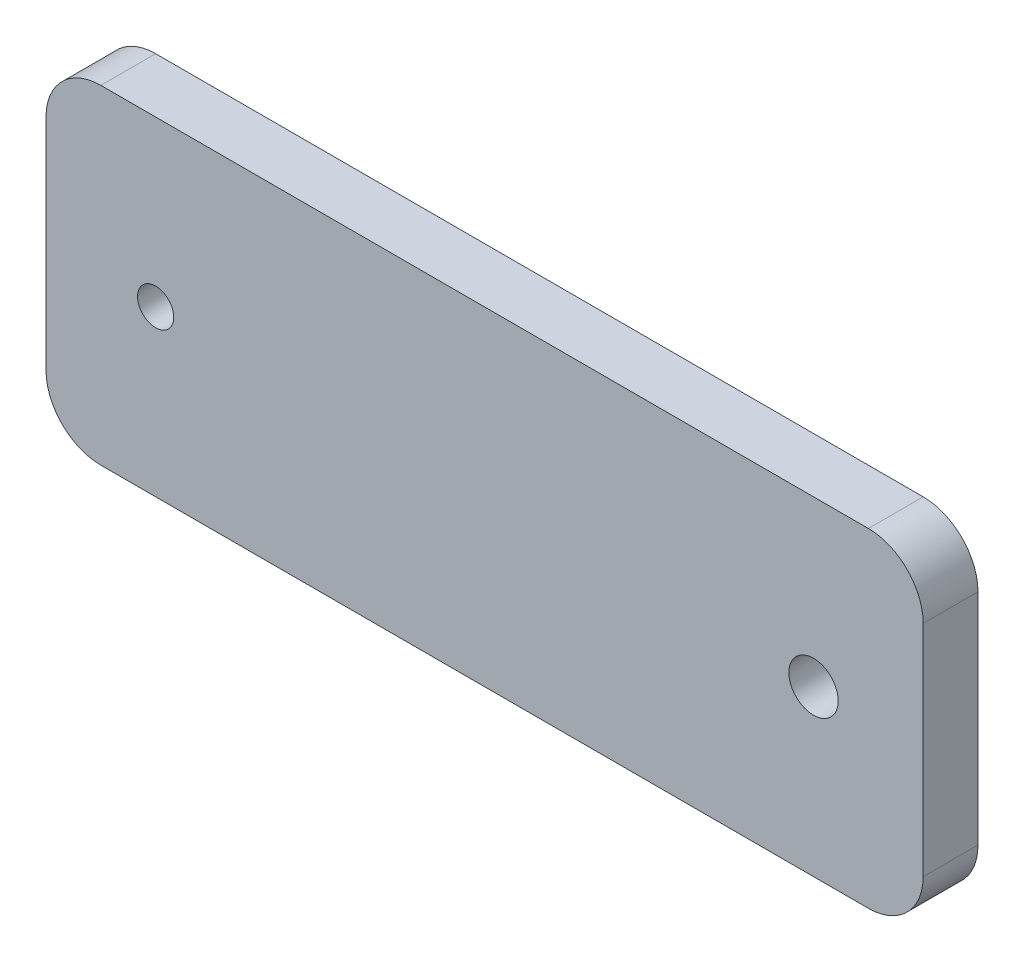
ISO-10303-21;
HEADER;
FILE_DESCRIPTION(('STEP AP214'),'2;1');
FILE_NAME('part.step','',(''),(''),'','','');
FILE_SCHEMA(('AUTOMOTIVE_DESIGN { 1 0 10303 214 1 1 1 1 }'));
ENDSEC;
DATA;
#1=APPLICATION_CONTEXT('core data for automotive mechanical design processes');
#2=APPLICATION_PROTOCOL_DEFINITION('international standard','automotive_design',2000,#1);
#3=PRODUCT_CONTEXT('',#1,'mechanical');
#4=PRODUCT('Part','Part','',(#3));
#5=PRODUCT_RELATED_PRODUCT_CATEGORY('part','',(#4));
#6=PRODUCT_DEFINITION_FORMATION('','',#4);
#7=PRODUCT_DEFINITION_CONTEXT('part definition',#1,'design');
#8=PRODUCT_DEFINITION('design','',#6,#7);
#9=PRODUCT_DEFINITION_SHAPE('','',#8);
#10=(LENGTH_UNIT() NAMED_UNIT(*) SI_UNIT(.MILLI.,.METRE.));
#11=(NAMED_UNIT(*) PLANE_ANGLE_UNIT() SI_UNIT($,.RADIAN.));
#12=(NAMED_UNIT(*) SI_UNIT($,.STERADIAN.) SOLID_ANGLE_UNIT());
#13=UNCERTAINTY_MEASURE_WITH_UNIT(LENGTH_MEASURE(1.E-05),#10,'distance_accuracy_value','');
#14=(GEOMETRIC_REPRESENTATION_CONTEXT(3) GLOBAL_UNCERTAINTY_ASSIGNED_CONTEXT((#13)) GLOBAL_UNIT_ASSIGNED_CONTEXT((#10,
#11,#12)) REPRESENTATION_CONTEXT('',''));
#15=CARTESIAN_POINT('',(0.,0.,0.));
#16=DIRECTION('',(0.,0.,1.));
#17=DIRECTION('',(1.,0.,0.));
#18=AXIS2_PLACEMENT_3D('',#15,#16,#17);
#19=CARTESIAN_POINT('',(35.,-10.,5.));
#20=DIRECTION('',(0.,0.,1.));
#21=DIRECTION('',(1.,0.,0.));
#22=AXIS2_PLACEMENT_3D('',#19,#20,#21);
#23=PLANE('',#22);
#24=CARTESIAN_POINT('',(-30.,0.,5.));
#25=DIRECTION('',(0.,0.,1.));
#26=DIRECTION('',(1.,0.,0.));
#27=AXIS2_PLACEMENT_3D('',#24,#25,#26);
#28=CIRCLE('',#27,1.64999999999999);
#29=CARTESIAN_POINT('',(-28.35,0.,5.));
#30=VERTEX_POINT('',#29);
#31=EDGE_CURVE('E191',#30,#30,#28,.T.);
#32=ORIENTED_EDGE('',*,*,#31,.F.);
#33=EDGE_LOOP('',(#32));
#34=FACE_BOUND('',#33,.T.);
#35=CARTESIAN_POINT('',(35.,-10.,5.));
#36=DIRECTION('',(0.,0.,1.));
#37=DIRECTION('',(1.,0.,0.));
#38=AXIS2_PLACEMENT_3D('',#35,#36,#37);
#39=CIRCLE('',#38,5.);
#40=CARTESIAN_POINT('',(35.,-15.,5.));
#41=VERTEX_POINT('',#40);
#42=CARTESIAN_POINT('',(40.,-9.99999999999996,5.));
#43=VERTEX_POINT('',#42);
#44=EDGE_CURVE('E149',#41,#43,#39,.T.);
#45=ORIENTED_EDGE('',*,*,#44,.T.);
#46=DIRECTION('',(0.,1.,0.));
#47=VECTOR('',#46,1.);
#48=CARTESIAN_POINT('',(40.,9.99999999999996,5.));
#49=LINE('',#48,#47);
#50=CARTESIAN_POINT('',(40.,9.99999999999997,5.));
#51=VERTEX_POINT('',#50);
#52=EDGE_CURVE('E97',#43,#51,#49,.T.);
#53=ORIENTED_EDGE('',*,*,#52,.T.);
#54=CARTESIAN_POINT('',(35.,10.,5.));
#55=DIRECTION('',(0.,0.,1.));
#56=DIRECTION('',(1.,0.,0.));
#57=AXIS2_PLACEMENT_3D('',#54,#55,#56);
#58=CIRCLE('',#57,5.);
#59=CARTESIAN_POINT('',(35.,15.,5.));
#60=VERTEX_POINT('',#59);
#61=EDGE_CURVE('E164',#51,#60,#58,.T.);
#62=ORIENTED_EDGE('',*,*,#61,.T.);
#63=DIRECTION('',(-1.,0.,0.));
#64=VECTOR('',#63,1.);
#65=CARTESIAN_POINT('',(-35.,15.,5.));
#66=LINE('',#65,#64);
#67=CARTESIAN_POINT('',(-35.,15.,5.));
#68=VERTEX_POINT('',#67);
#69=EDGE_CURVE('E177',#60,#68,#66,.T.);
#70=ORIENTED_EDGE('',*,*,#69,.T.);
#71=CARTESIAN_POINT('',(-35.,10.,5.));
#72=DIRECTION('',(0.,0.,1.));
#73=DIRECTION('',(-1.,0.,0.));
#74=AXIS2_PLACEMENT_3D('',#71,#72,#73);
#75=CIRCLE('',#74,5.);
#76=CARTESIAN_POINT('',(-40.,9.99999999999996,5.));
#77=VERTEX_POINT('',#76);
#78=EDGE_CURVE('E116',#68,#77,#75,.T.);
#79=ORIENTED_EDGE('',*,*,#78,.T.);
#80=DIRECTION('',(0.,-1.,0.));
#81=VECTOR('',#80,1.);
#82=CARTESIAN_POINT('',(-40.,9.99999999999996,5.));
#83=LINE('',#82,#81);
#84=CARTESIAN_POINT('',(-40.,-9.99999999999997,5.));
#85=VERTEX_POINT('',#84);
#86=EDGE_CURVE('E110',#77,#85,#83,.T.);
#87=ORIENTED_EDGE('',*,*,#86,.T.);
#88=CARTESIAN_POINT('',(-35.,-10.,5.));
#89=DIRECTION('',(0.,0.,1.));
#90=DIRECTION('',(-1.,0.,0.));
#91=AXIS2_PLACEMENT_3D('',#88,#89,#90);
#92=CIRCLE('',#91,5.);
#93=CARTESIAN_POINT('',(-35.,-15.,5.));
#94=VERTEX_POINT('',#93);
#95=EDGE_CURVE('E114',#85,#94,#92,.T.);
#96=ORIENTED_EDGE('',*,*,#95,.T.);
#97=DIRECTION('',(1.,0.,0.));
#98=VECTOR('',#97,1.);
#99=CARTESIAN_POINT('',(-35.,-15.,5.));
#100=LINE('',#99,#98);
#101=EDGE_CURVE('E54',#94,#41,#100,.T.);
#102=ORIENTED_EDGE('',*,*,#101,.T.);
#103=EDGE_LOOP('',(#45,#53,#62,#70,#79,#87,#96,#102));
#104=FACE_BOUND('',#103,.T.);
#105=CARTESIAN_POINT('',(30.,0.,5.));
#106=DIRECTION('',(0.,0.,1.));
#107=DIRECTION('',(1.,0.,0.));
#108=AXIS2_PLACEMENT_3D('',#105,#106,#107);
#109=CIRCLE('',#108,2.25);
#110=CARTESIAN_POINT('',(32.25,0.,5.));
#111=VERTEX_POINT('',#110);
#112=EDGE_CURVE('E138',#111,#111,#109,.T.);
#113=ORIENTED_EDGE('',*,*,#112,.F.);
#114=EDGE_LOOP('',(#113));
#115=FACE_BOUND('',#114,.T.);
#116=ADVANCED_FACE('F37',(#34,#104,#115),#23,.T.);
#117=CARTESIAN_POINT('',(35.,-10.,0.));
#118=DIRECTION('',(0.,0.,1.));
#119=DIRECTION('',(1.,0.,0.));
#120=AXIS2_PLACEMENT_3D('',#117,#118,#119);
#121=PLANE('',#120);
#122=CARTESIAN_POINT('',(-30.,0.,0.));
#123=DIRECTION('',(0.,0.,1.));
#124=DIRECTION('',(1.,0.,0.));
#125=AXIS2_PLACEMENT_3D('',#122,#123,#124);
#126=CIRCLE('',#125,1.64999999999999);
#127=CARTESIAN_POINT('',(-28.35,0.,0.));
#128=VERTEX_POINT('',#127);
#129=EDGE_CURVE('E186',#128,#128,#126,.T.);
#130=ORIENTED_EDGE('',*,*,#129,.T.);
#131=EDGE_LOOP('',(#130));
#132=FACE_BOUND('',#131,.T.);
#133=CARTESIAN_POINT('',(35.,-10.,0.));
#134=DIRECTION('',(0.,0.,1.));
#135=DIRECTION('',(1.,0.,0.));
#136=AXIS2_PLACEMENT_3D('',#133,#134,#135);
#137=CIRCLE('',#136,5.);
#138=CARTESIAN_POINT('',(35.,-15.,0.));
#139=VERTEX_POINT('',#138);
#140=CARTESIAN_POINT('',(40.,-9.99999999999996,0.));
#141=VERTEX_POINT('',#140);
#142=EDGE_CURVE('E134',#139,#141,#137,.T.);
#143=ORIENTED_EDGE('',*,*,#142,.F.);
#144=DIRECTION('',(1.,0.,0.));
#145=VECTOR('',#144,1.);
#146=CARTESIAN_POINT('',(-35.,-15.,0.));
#147=LINE('',#146,#145);
#148=CARTESIAN_POINT('',(-35.,-15.,0.));
#149=VERTEX_POINT('',#148);
#150=EDGE_CURVE('E89',#149,#139,#147,.T.);
#151=ORIENTED_EDGE('',*,*,#150,.F.);
#152=CARTESIAN_POINT('',(-35.,-10.,0.));
#153=DIRECTION('',(0.,0.,1.));
#154=DIRECTION('',(-1.,0.,0.));
#155=AXIS2_PLACEMENT_3D('',#152,#153,#154);
#156=CIRCLE('',#155,5.);
#157=CARTESIAN_POINT('',(-40.,-9.99999999999997,0.));
#158=VERTEX_POINT('',#157);
#159=EDGE_CURVE('E83',#158,#149,#156,.T.);
#160=ORIENTED_EDGE('',*,*,#159,.F.);
#161=DIRECTION('',(0.,-1.,0.));
#162=VECTOR('',#161,1.);
#163=CARTESIAN_POINT('',(-40.,9.99999999999996,0.));
#164=LINE('',#163,#162);
#165=CARTESIAN_POINT('',(-40.,9.99999999999996,0.));
#166=VERTEX_POINT('',#165);
#167=EDGE_CURVE('E124',#166,#158,#164,.T.);
#168=ORIENTED_EDGE('',*,*,#167,.F.);
#169=CARTESIAN_POINT('',(-35.,10.,0.));
#170=DIRECTION('',(0.,0.,1.));
#171=DIRECTION('',(-1.,0.,0.));
#172=AXIS2_PLACEMENT_3D('',#169,#170,#171);
#173=CIRCLE('',#172,5.);
#174=CARTESIAN_POINT('',(-35.,15.,0.));
#175=VERTEX_POINT('',#174);
#176=EDGE_CURVE('E144',#175,#166,#173,.T.);
#177=ORIENTED_EDGE('',*,*,#176,.F.);
#178=DIRECTION('',(-1.,0.,0.));
#179=VECTOR('',#178,1.);
#180=CARTESIAN_POINT('',(-35.,15.,0.));
#181=LINE('',#180,#179);
#182=CARTESIAN_POINT('',(35.,15.,0.));
#183=VERTEX_POINT('',#182);
#184=EDGE_CURVE('E142',#183,#175,#181,.T.);
#185=ORIENTED_EDGE('',*,*,#184,.F.);
#186=CARTESIAN_POINT('',(35.,10.,0.));
#187=DIRECTION('',(0.,0.,1.));
#188=DIRECTION('',(1.,0.,0.));
#189=AXIS2_PLACEMENT_3D('',#186,#187,#188);
#190=CIRCLE('',#189,5.);
#191=CARTESIAN_POINT('',(40.,9.99999999999997,0.));
#192=VERTEX_POINT('',#191);
#193=EDGE_CURVE('E140',#192,#183,#190,.T.);
#194=ORIENTED_EDGE('',*,*,#193,.F.);
#195=DIRECTION('',(0.,1.,0.));
#196=VECTOR('',#195,1.);
#197=CARTESIAN_POINT('',(40.,9.99999999999996,0.));
#198=LINE('',#197,#196);
#199=EDGE_CURVE('E137',#141,#192,#198,.T.);
#200=ORIENTED_EDGE('',*,*,#199,.F.);
#201=EDGE_LOOP('',(#143,#151,#160,#168,#177,#185,#194,#200));
#202=FACE_BOUND('',#201,.T.);
#203=CARTESIAN_POINT('',(30.,0.,0.));
#204=DIRECTION('',(0.,0.,1.));
#205=DIRECTION('',(1.,0.,0.));
#206=AXIS2_PLACEMENT_3D('',#203,#204,#205);
#207=CIRCLE('',#206,2.25);
#208=CARTESIAN_POINT('',(32.25,0.,0.));
#209=VERTEX_POINT('',#208);
#210=EDGE_CURVE('E183',#209,#209,#207,.T.);
#211=ORIENTED_EDGE('',*,*,#210,.T.);
#212=EDGE_LOOP('',(#211));
#213=FACE_BOUND('',#212,.T.);
#214=ADVANCED_FACE('F168',(#132,#202,#213),#121,.F.);
#215=CARTESIAN_POINT('',(35.,-10.,5.));
#216=DIRECTION('',(0.,0.,-1.));
#217=DIRECTION('',(-1.,0.,0.));
#218=AXIS2_PLACEMENT_3D('',#215,#216,#217);
#219=CYLINDRICAL_SURFACE('',#218,5.);
#220=ORIENTED_EDGE('',*,*,#142,.T.);
#221=DIRECTION('',(0.,0.,-1.));
#222=VECTOR('',#221,1.);
#223=CARTESIAN_POINT('',(40.,-9.99999999999996,5.));
#224=LINE('',#223,#222);
#225=EDGE_CURVE('E11',#43,#141,#224,.T.);
#226=ORIENTED_EDGE('',*,*,#225,.F.);
#227=ORIENTED_EDGE('',*,*,#44,.F.);
#228=DIRECTION('',(0.,0.,-1.));
#229=VECTOR('',#228,1.);
#230=CARTESIAN_POINT('',(35.,-15.,5.));
#231=LINE('',#230,#229);
#232=EDGE_CURVE('E130',#41,#139,#231,.T.);
#233=ORIENTED_EDGE('',*,*,#232,.T.);
#234=EDGE_LOOP('',(#220,#226,#227,#233));
#235=FACE_BOUND('',#234,.T.);
#236=ADVANCED_FACE('F39',(#235),#219,.T.);
#237=CARTESIAN_POINT('',(40.,9.99999999999996,5.));
#238=DIRECTION('',(-1.,0.,0.));
#239=DIRECTION('',(0.,-1.,0.));
#240=AXIS2_PLACEMENT_3D('',#237,#238,#239);
#241=PLANE('',#240);
#242=ORIENTED_EDGE('',*,*,#199,.T.);
#243=DIRECTION('',(0.,0.,-1.));
#244=VECTOR('',#243,1.);
#245=CARTESIAN_POINT('',(40.,9.99999999999997,5.));
#246=LINE('',#245,#244);
#247=EDGE_CURVE('E46',#51,#192,#246,.T.);
#248=ORIENTED_EDGE('',*,*,#247,.F.);
#249=ORIENTED_EDGE('',*,*,#52,.F.);
#250=ORIENTED_EDGE('',*,*,#225,.T.);
#251=EDGE_LOOP('',(#242,#248,#249,#250));
#252=FACE_BOUND('',#251,.T.);
#253=ADVANCED_FACE('F220',(#252),#241,.F.);
#254=CARTESIAN_POINT('',(35.,10.,5.));
#255=DIRECTION('',(0.,0.,-1.));
#256=DIRECTION('',(-1.,0.,0.));
#257=AXIS2_PLACEMENT_3D('',#254,#255,#256);
#258=CYLINDRICAL_SURFACE('',#257,5.);
#259=ORIENTED_EDGE('',*,*,#193,.T.);
#260=DIRECTION('',(0.,0.,-1.));
#261=VECTOR('',#260,1.);
#262=CARTESIAN_POINT('',(35.,15.,5.));
#263=LINE('',#262,#261);
#264=EDGE_CURVE('E156',#60,#183,#263,.T.);
#265=ORIENTED_EDGE('',*,*,#264,.F.);
#266=ORIENTED_EDGE('',*,*,#61,.F.);
#267=ORIENTED_EDGE('',*,*,#247,.T.);
#268=EDGE_LOOP('',(#259,#265,#266,#267));
#269=FACE_BOUND('',#268,.T.);
#270=ADVANCED_FACE('F162',(#269),#258,.T.);
#271=CARTESIAN_POINT('',(-35.,15.,5.));
#272=DIRECTION('',(0.,-1.,0.));
#273=DIRECTION('',(0.,0.,-1.));
#274=AXIS2_PLACEMENT_3D('',#271,#272,#273);
#275=PLANE('',#274);
#276=ORIENTED_EDGE('',*,*,#184,.T.);
#277=DIRECTION('',(0.,0.,-1.));
#278=VECTOR('',#277,1.);
#279=CARTESIAN_POINT('',(-35.,15.,5.));
#280=LINE('',#279,#278);
#281=EDGE_CURVE('E153',#68,#175,#280,.T.);
#282=ORIENTED_EDGE('',*,*,#281,.F.);
#283=ORIENTED_EDGE('',*,*,#69,.F.);
#284=ORIENTED_EDGE('',*,*,#264,.T.);
#285=EDGE_LOOP('',(#276,#282,#283,#284));
#286=FACE_BOUND('',#285,.T.);
#287=ADVANCED_FACE('F173',(#286),#275,.F.);
#288=CARTESIAN_POINT('',(-35.,10.,5.));
#289=DIRECTION('',(0.,0.,-1.));
#290=DIRECTION('',(-1.,0.,0.));
#291=AXIS2_PLACEMENT_3D('',#288,#289,#290);
#292=CYLINDRICAL_SURFACE('',#291,5.);
#293=ORIENTED_EDGE('',*,*,#176,.T.);
#294=DIRECTION('',(0.,0.,-1.));
#295=VECTOR('',#294,1.);
#296=CARTESIAN_POINT('',(-40.,9.99999999999996,5.));
#297=LINE('',#296,#295);
#298=EDGE_CURVE('E125',#77,#166,#297,.T.);
#299=ORIENTED_EDGE('',*,*,#298,.F.);
#300=ORIENTED_EDGE('',*,*,#78,.F.);
#301=ORIENTED_EDGE('',*,*,#281,.T.);
#302=EDGE_LOOP('',(#293,#299,#300,#301));
#303=FACE_BOUND('',#302,.T.);
#304=ADVANCED_FACE('F176',(#303),#292,.T.);
#305=CARTESIAN_POINT('',(-40.,9.99999999999996,5.));
#306=DIRECTION('',(1.,0.,0.));
#307=DIRECTION('',(0.,1.,0.));
#308=AXIS2_PLACEMENT_3D('',#305,#306,#307);
#309=PLANE('',#308);
#310=ORIENTED_EDGE('',*,*,#167,.T.);
#311=DIRECTION('',(0.,0.,-1.));
#312=VECTOR('',#311,1.);
#313=CARTESIAN_POINT('',(-40.,-9.99999999999997,5.));
#314=LINE('',#313,#312);
#315=EDGE_CURVE('E121',#85,#158,#314,.T.);
#316=ORIENTED_EDGE('',*,*,#315,.F.);
#317=ORIENTED_EDGE('',*,*,#86,.F.);
#318=ORIENTED_EDGE('',*,*,#298,.T.);
#319=EDGE_LOOP('',(#310,#316,#317,#318));
#320=FACE_BOUND('',#319,.T.);
#321=ADVANCED_FACE('F122',(#320),#309,.F.);
#322=CARTESIAN_POINT('',(-35.,-10.,5.));
#323=DIRECTION('',(0.,0.,-1.));
#324=DIRECTION('',(-1.,0.,0.));
#325=AXIS2_PLACEMENT_3D('',#322,#323,#324);
#326=CYLINDRICAL_SURFACE('',#325,5.);
#327=ORIENTED_EDGE('',*,*,#159,.T.);
#328=DIRECTION('',(0.,0.,-1.));
#329=VECTOR('',#328,1.);
#330=CARTESIAN_POINT('',(-35.,-15.,5.));
#331=LINE('',#330,#329);
#332=EDGE_CURVE('E126',#94,#149,#331,.T.);
#333=ORIENTED_EDGE('',*,*,#332,.F.);
#334=ORIENTED_EDGE('',*,*,#95,.F.);
#335=ORIENTED_EDGE('',*,*,#315,.T.);
#336=EDGE_LOOP('',(#327,#333,#334,#335));
#337=FACE_BOUND('',#336,.T.);
#338=ADVANCED_FACE('F128',(#337),#326,.T.);
#339=CARTESIAN_POINT('',(-35.,-15.,5.));
#340=DIRECTION('',(0.,1.,0.));
#341=DIRECTION('',(0.,0.,1.));
#342=AXIS2_PLACEMENT_3D('',#339,#340,#341);
#343=PLANE('',#342);
#344=ORIENTED_EDGE('',*,*,#150,.T.);
#345=ORIENTED_EDGE('',*,*,#232,.F.);
#346=ORIENTED_EDGE('',*,*,#101,.F.);
#347=ORIENTED_EDGE('',*,*,#332,.T.);
#348=EDGE_LOOP('',(#344,#345,#346,#347));
#349=FACE_BOUND('',#348,.T.);
#350=ADVANCED_FACE('F208',(#349),#343,.F.);
#351=CARTESIAN_POINT('',(30.,0.,5.));
#352=DIRECTION('',(0.,0.,-1.));
#353=DIRECTION('',(-1.,0.,0.));
#354=AXIS2_PLACEMENT_3D('',#351,#352,#353);
#355=CYLINDRICAL_SURFACE('',#354,2.25);
#356=ORIENTED_EDGE('',*,*,#112,.T.);
#357=EDGE_LOOP('',(#356));
#358=FACE_BOUND('',#357,.T.);
#359=ORIENTED_EDGE('',*,*,#210,.F.);
#360=EDGE_LOOP('',(#359));
#361=FACE_BOUND('',#360,.T.);
#362=ADVANCED_FACE('F205',(#358,#361),#355,.F.);
#363=CARTESIAN_POINT('',(-30.,0.,5.));
#364=DIRECTION('',(0.,0.,1.));
#365=DIRECTION('',(1.,0.,0.));
#366=AXIS2_PLACEMENT_3D('',#363,#364,#365);
#367=CYLINDRICAL_SURFACE('',#366,1.64999999999999);
#368=ORIENTED_EDGE('',*,*,#129,.F.);
#369=EDGE_LOOP('',(#368));
#370=FACE_BOUND('',#369,.T.);
#371=ORIENTED_EDGE('',*,*,#31,.T.);
#372=EDGE_LOOP('',(#371));
#373=FACE_BOUND('',#372,.T.);
#374=ADVANCED_FACE('F195',(#370,#373),#367,.F.);
#375=CLOSED_SHELL('',(#116,#214,#236,#253,#270,#287,#304,#321,#338,#350,#362,#374));
#376=MANIFOLD_SOLID_BREP('B2',#375);
#377=ADVANCED_BREP_SHAPE_REPRESENTATION('',(#18,#376),#14);
#378=SHAPE_DEFINITION_REPRESENTATION(#9,#377);
ENDSEC;
END-ISO-10303-21;
